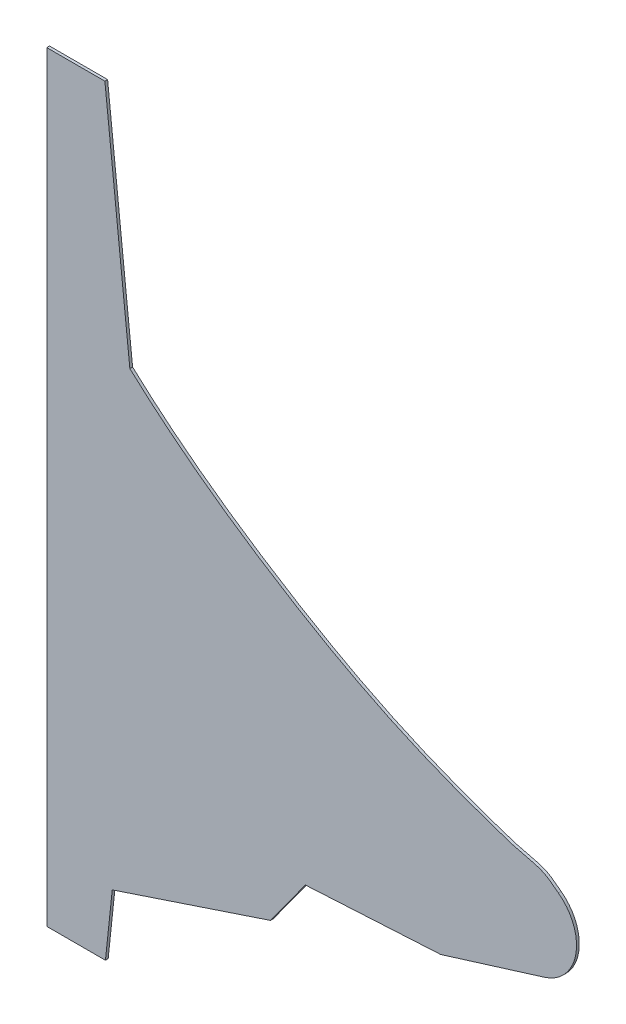
ISO-10303-21;
HEADER;
FILE_DESCRIPTION(('STEP AP214'),'2;1');
FILE_NAME('part.step','',(''),(''),'','','');
FILE_SCHEMA(('AUTOMOTIVE_DESIGN { 1 0 10303 214 1 1 1 1 }'));
ENDSEC;
DATA;
#1=APPLICATION_CONTEXT('core data for automotive mechanical design processes');
#2=APPLICATION_PROTOCOL_DEFINITION('international standard','automotive_design',2000,#1);
#3=PRODUCT_CONTEXT('',#1,'mechanical');
#4=PRODUCT('Part','Part','',(#3));
#5=PRODUCT_RELATED_PRODUCT_CATEGORY('part','',(#4));
#6=PRODUCT_DEFINITION_FORMATION('','',#4);
#7=PRODUCT_DEFINITION_CONTEXT('part definition',#1,'design');
#8=PRODUCT_DEFINITION('design','',#6,#7);
#9=PRODUCT_DEFINITION_SHAPE('','',#8);
#10=(LENGTH_UNIT() NAMED_UNIT(*) SI_UNIT(.MILLI.,.METRE.));
#11=(NAMED_UNIT(*) PLANE_ANGLE_UNIT() SI_UNIT($,.RADIAN.));
#12=(NAMED_UNIT(*) SI_UNIT($,.STERADIAN.) SOLID_ANGLE_UNIT());
#13=UNCERTAINTY_MEASURE_WITH_UNIT(LENGTH_MEASURE(1.E-05),#10,'distance_accuracy_value','');
#14=(GEOMETRIC_REPRESENTATION_CONTEXT(3) GLOBAL_UNCERTAINTY_ASSIGNED_CONTEXT((#13)) GLOBAL_UNIT_ASSIGNED_CONTEXT((#10,
#11,#12)) REPRESENTATION_CONTEXT('',''));
#15=CARTESIAN_POINT('',(0.,0.,0.));
#16=DIRECTION('',(0.,0.,1.));
#17=DIRECTION('',(1.,0.,0.));
#18=AXIS2_PLACEMENT_3D('',#15,#16,#17);
#19=CARTESIAN_POINT('',(10.3654221407447,74.8313731891077,0.23));
#20=DIRECTION('',(0.,-1.,0.));
#21=DIRECTION('',(0.,0.,-1.));
#22=AXIS2_PLACEMENT_3D('',#19,#20,#21);
#23=PLANE('',#22);
#24=DIRECTION('',(-1.,0.,0.));
#25=VECTOR('',#24,1.);
#26=CARTESIAN_POINT('',(10.3654221407447,74.8313731891077,0.));
#27=LINE('',#26,#25);
#28=CARTESIAN_POINT('',(15.256321742071,74.8313731891077,0.));
#29=VERTEX_POINT('',#28);
#30=CARTESIAN_POINT('',(10.3654221407447,74.8313731891077,0.));
#31=VERTEX_POINT('',#30);
#32=EDGE_CURVE('E199',#29,#31,#27,.T.);
#33=ORIENTED_EDGE('',*,*,#32,.T.);
#34=DIRECTION('',(0.,0.,-1.));
#35=VECTOR('',#34,1.);
#36=CARTESIAN_POINT('',(10.3654221407447,74.8313731891077,0.23));
#37=LINE('',#36,#35);
#38=CARTESIAN_POINT('',(10.3654221407447,74.8313731891077,0.23));
#39=VERTEX_POINT('',#38);
#40=EDGE_CURVE('E11',#39,#31,#37,.T.);
#41=ORIENTED_EDGE('',*,*,#40,.F.);
#42=DIRECTION('',(-1.,0.,0.));
#43=VECTOR('',#42,1.);
#44=CARTESIAN_POINT('',(10.3654221407447,74.8313731891077,0.23));
#45=LINE('',#44,#43);
#46=CARTESIAN_POINT('',(15.256321742071,74.8313731891077,0.23));
#47=VERTEX_POINT('',#46);
#48=EDGE_CURVE('E228',#47,#39,#45,.T.);
#49=ORIENTED_EDGE('',*,*,#48,.F.);
#50=DIRECTION('',(0.,0.,-1.));
#51=VECTOR('',#50,1.);
#52=CARTESIAN_POINT('',(15.256321742071,74.8313731891077,0.23));
#53=LINE('',#52,#51);
#54=EDGE_CURVE('E143',#47,#29,#53,.T.);
#55=ORIENTED_EDGE('',*,*,#54,.T.);
#56=EDGE_LOOP('',(#33,#41,#49,#55));
#57=FACE_BOUND('',#56,.T.);
#58=ADVANCED_FACE('F33',(#57),#23,.F.);
#59=CARTESIAN_POINT('',(10.3654221407447,74.8313731891077,0.23));
#60=DIRECTION('',(1.,0.,0.));
#61=DIRECTION('',(0.,1.,0.));
#62=AXIS2_PLACEMENT_3D('',#59,#60,#61);
#63=PLANE('',#62);
#64=DIRECTION('',(0.,-1.,0.));
#65=VECTOR('',#64,1.);
#66=CARTESIAN_POINT('',(10.3654221407447,74.8313731891077,0.));
#67=LINE('',#66,#65);
#68=CARTESIAN_POINT('',(10.3654221407447,10.7767070281172,0.));
#69=VERTEX_POINT('',#68);
#70=EDGE_CURVE('E190',#31,#69,#67,.T.);
#71=ORIENTED_EDGE('',*,*,#70,.T.);
#72=DIRECTION('',(0.,0.,-1.));
#73=VECTOR('',#72,1.);
#74=CARTESIAN_POINT('',(10.3654221407447,10.7767070281172,0.23));
#75=LINE('',#74,#73);
#76=CARTESIAN_POINT('',(10.3654221407447,10.7767070281172,0.23));
#77=VERTEX_POINT('',#76);
#78=EDGE_CURVE('E41',#77,#69,#75,.T.);
#79=ORIENTED_EDGE('',*,*,#78,.F.);
#80=DIRECTION('',(0.,-1.,0.));
#81=VECTOR('',#80,1.);
#82=CARTESIAN_POINT('',(10.3654221407447,74.8313731891077,0.23));
#83=LINE('',#82,#81);
#84=EDGE_CURVE('E101',#39,#77,#83,.T.);
#85=ORIENTED_EDGE('',*,*,#84,.F.);
#86=ORIENTED_EDGE('',*,*,#40,.T.);
#87=EDGE_LOOP('',(#71,#79,#85,#86));
#88=FACE_BOUND('',#87,.T.);
#89=ADVANCED_FACE('F183',(#88),#63,.F.);
#90=CARTESIAN_POINT('',(10.3654221407447,10.7767070281172,0.23));
#91=DIRECTION('',(0.,1.,0.));
#92=DIRECTION('',(0.,0.,1.));
#93=AXIS2_PLACEMENT_3D('',#90,#91,#92);
#94=PLANE('',#93);
#95=DIRECTION('',(1.,0.,0.));
#96=VECTOR('',#95,1.);
#97=CARTESIAN_POINT('',(10.3654221407447,10.7767070281172,0.));
#98=LINE('',#97,#96);
#99=CARTESIAN_POINT('',(15.3029753186407,10.7767070281172,0.));
#100=VERTEX_POINT('',#99);
#101=EDGE_CURVE('E198',#69,#100,#98,.T.);
#102=ORIENTED_EDGE('',*,*,#101,.T.);
#103=DIRECTION('',(0.,0.,-1.));
#104=VECTOR('',#103,1.);
#105=CARTESIAN_POINT('',(15.3029753186407,10.7767070281172,0.23));
#106=LINE('',#105,#104);
#107=CARTESIAN_POINT('',(15.3029753186407,10.7767070281172,0.23));
#108=VERTEX_POINT('',#107);
#109=EDGE_CURVE('E204',#108,#100,#106,.T.);
#110=ORIENTED_EDGE('',*,*,#109,.F.);
#111=DIRECTION('',(1.,0.,0.));
#112=VECTOR('',#111,1.);
#113=CARTESIAN_POINT('',(10.3654221407447,10.7767070281172,0.23));
#114=LINE('',#113,#112);
#115=EDGE_CURVE('E203',#77,#108,#114,.T.);
#116=ORIENTED_EDGE('',*,*,#115,.F.);
#117=ORIENTED_EDGE('',*,*,#78,.T.);
#118=EDGE_LOOP('',(#102,#110,#116,#117));
#119=FACE_BOUND('',#118,.T.);
#120=ADVANCED_FACE('F180',(#119),#94,.F.);
#121=CARTESIAN_POINT('',(15.3029753186407,10.7767070281172,0.23));
#122=DIRECTION('',(-0.994445105699646,0.105256504549693,0.));
#123=DIRECTION('',(-0.105256504549693,-0.994445105699646,0.));
#124=AXIS2_PLACEMENT_3D('',#121,#122,#123);
#125=PLANE('',#124);
#126=DIRECTION('',(0.105256504549693,0.994445105699646,0.));
#127=VECTOR('',#126,1.);
#128=CARTESIAN_POINT('',(15.3029753186407,10.7767070281172,0.));
#129=LINE('',#128,#127);
#130=CARTESIAN_POINT('',(15.8764924252464,16.1951966705297,0.));
#131=VERTEX_POINT('',#130);
#132=EDGE_CURVE('E208',#100,#131,#129,.T.);
#133=ORIENTED_EDGE('',*,*,#132,.T.);
#134=DIRECTION('',(0.,0.,-1.));
#135=VECTOR('',#134,1.);
#136=CARTESIAN_POINT('',(15.8764924252464,16.1951966705297,0.23));
#137=LINE('',#136,#135);
#138=CARTESIAN_POINT('',(15.8764924252464,16.1951966705297,0.23));
#139=VERTEX_POINT('',#138);
#140=EDGE_CURVE('E241',#139,#131,#137,.T.);
#141=ORIENTED_EDGE('',*,*,#140,.F.);
#142=DIRECTION('',(0.105256504549693,0.994445105699646,0.));
#143=VECTOR('',#142,1.);
#144=CARTESIAN_POINT('',(15.3029753186407,10.7767070281172,0.23));
#145=LINE('',#144,#143);
#146=EDGE_CURVE('E246',#108,#139,#145,.T.);
#147=ORIENTED_EDGE('',*,*,#146,.F.);
#148=ORIENTED_EDGE('',*,*,#109,.T.);
#149=EDGE_LOOP('',(#133,#141,#147,#148));
#150=FACE_BOUND('',#149,.T.);
#151=ADVANCED_FACE('F176',(#150),#125,.F.);
#152=CARTESIAN_POINT('',(15.8764924252464,16.1951966705297,0.23));
#153=DIRECTION('',(-0.315711066166802,0.948855375017616,0.));
#154=DIRECTION('',(-0.948855375017616,-0.315711066166802,0.));
#155=AXIS2_PLACEMENT_3D('',#152,#153,#154);
#156=PLANE('',#155);
#157=DIRECTION('',(0.948855375017616,0.315711066166802,0.));
#158=VECTOR('',#157,1.);
#159=CARTESIAN_POINT('',(15.8764924252464,16.1951966705297,0.));
#160=LINE('',#159,#158);
#161=CARTESIAN_POINT('',(29.1952251447183,20.6267163916221,0.));
#162=VERTEX_POINT('',#161);
#163=EDGE_CURVE('E210',#131,#162,#160,.T.);
#164=ORIENTED_EDGE('',*,*,#163,.T.);
#165=DIRECTION('',(0.,0.,-1.));
#166=VECTOR('',#165,1.);
#167=CARTESIAN_POINT('',(29.1952251447183,20.6267163916221,0.23));
#168=LINE('',#167,#166);
#169=CARTESIAN_POINT('',(29.1952251447183,20.6267163916221,0.23));
#170=VERTEX_POINT('',#169);
#171=EDGE_CURVE('E238',#170,#162,#168,.T.);
#172=ORIENTED_EDGE('',*,*,#171,.F.);
#173=DIRECTION('',(0.948855375017616,0.315711066166802,0.));
#174=VECTOR('',#173,1.);
#175=CARTESIAN_POINT('',(15.8764924252464,16.1951966705297,0.23));
#176=LINE('',#175,#174);
#177=EDGE_CURVE('E248',#139,#170,#176,.T.);
#178=ORIENTED_EDGE('',*,*,#177,.F.);
#179=ORIENTED_EDGE('',*,*,#140,.T.);
#180=EDGE_LOOP('',(#164,#172,#178,#179));
#181=FACE_BOUND('',#180,.T.);
#182=ADVANCED_FACE('F172',(#181),#156,.F.);
#183=CARTESIAN_POINT('',(29.1952251447183,20.6267163916221,0.23));
#184=DIRECTION('',(-0.809610443394388,0.586967571460931,0.));
#185=DIRECTION('',(-0.586967571460931,-0.809610443394388,0.));
#186=AXIS2_PLACEMENT_3D('',#183,#184,#185);
#187=PLANE('',#186);
#188=DIRECTION('',(0.586967571460931,0.809610443394387,0.));
#189=VECTOR('',#188,1.);
#190=CARTESIAN_POINT('',(29.1952251447183,20.6267163916221,0.));
#191=LINE('',#190,#189);
#192=CARTESIAN_POINT('',(32.1311092142506,24.6762116599427,0.));
#193=VERTEX_POINT('',#192);
#194=EDGE_CURVE('E214',#162,#193,#191,.T.);
#195=ORIENTED_EDGE('',*,*,#194,.T.);
#196=DIRECTION('',(0.,0.,-1.));
#197=VECTOR('',#196,1.);
#198=CARTESIAN_POINT('',(32.1311092142506,24.6762116599427,0.23));
#199=LINE('',#198,#197);
#200=CARTESIAN_POINT('',(32.1311092142506,24.6762116599427,0.23));
#201=VERTEX_POINT('',#200);
#202=EDGE_CURVE('E235',#201,#193,#199,.T.);
#203=ORIENTED_EDGE('',*,*,#202,.F.);
#204=DIRECTION('',(0.586967571460931,0.809610443394387,0.));
#205=VECTOR('',#204,1.);
#206=CARTESIAN_POINT('',(29.1952251447183,20.6267163916221,0.23));
#207=LINE('',#206,#205);
#208=EDGE_CURVE('E250',#170,#201,#207,.T.);
#209=ORIENTED_EDGE('',*,*,#208,.F.);
#210=ORIENTED_EDGE('',*,*,#171,.T.);
#211=EDGE_LOOP('',(#195,#203,#209,#210));
#212=FACE_BOUND('',#211,.T.);
#213=ADVANCED_FACE('F168',(#212),#187,.F.);
#214=CARTESIAN_POINT('',(32.1311092142506,24.6762116599427,0.23));
#215=DIRECTION('',(-0.055258438295618,0.998472085236803,0.));
#216=DIRECTION('',(-0.998472085236803,-0.055258438295618,0.));
#217=AXIS2_PLACEMENT_3D('',#214,#215,#216);
#218=PLANE('',#217);
#219=DIRECTION('',(0.998472085236803,0.055258438295618,0.));
#220=VECTOR('',#219,1.);
#221=CARTESIAN_POINT('',(32.1311092142506,24.6762116599427,0.));
#222=LINE('',#221,#220);
#223=CARTESIAN_POINT('',(43.5206626622156,25.3065436899761,0.));
#224=VERTEX_POINT('',#223);
#225=EDGE_CURVE('E216',#193,#224,#222,.T.);
#226=ORIENTED_EDGE('',*,*,#225,.T.);
#227=DIRECTION('',(0.,0.,-1.));
#228=VECTOR('',#227,1.);
#229=CARTESIAN_POINT('',(43.5206626622156,25.3065436899761,0.23));
#230=LINE('',#229,#228);
#231=CARTESIAN_POINT('',(43.5206626622156,25.3065436899761,0.23));
#232=VERTEX_POINT('',#231);
#233=EDGE_CURVE('E232',#232,#224,#230,.T.);
#234=ORIENTED_EDGE('',*,*,#233,.F.);
#235=DIRECTION('',(0.998472085236803,0.055258438295618,0.));
#236=VECTOR('',#235,1.);
#237=CARTESIAN_POINT('',(32.1311092142506,24.6762116599427,0.23));
#238=LINE('',#237,#236);
#239=EDGE_CURVE('E256',#201,#232,#238,.T.);
#240=ORIENTED_EDGE('',*,*,#239,.F.);
#241=ORIENTED_EDGE('',*,*,#202,.T.);
#242=EDGE_LOOP('',(#226,#234,#240,#241));
#243=FACE_BOUND('',#242,.T.);
#244=ADVANCED_FACE('F164',(#243),#218,.F.);
#245=CARTESIAN_POINT('',(43.5206626622156,25.3065436899761,0.23));
#246=DIRECTION('',(-0.296030130531952,0.955178602051593,0.));
#247=DIRECTION('',(-0.955178602051593,-0.296030130531952,0.));
#248=AXIS2_PLACEMENT_3D('',#245,#246,#247);
#249=PLANE('',#248);
#250=DIRECTION('',(0.955178602051593,0.296030130531952,0.));
#251=VECTOR('',#250,1.);
#252=CARTESIAN_POINT('',(43.5206626622156,25.3065436899761,0.));
#253=LINE('',#252,#251);
#254=CARTESIAN_POINT('',(52.2515158167673,28.0124204688799,0.));
#255=VERTEX_POINT('',#254);
#256=EDGE_CURVE('E218',#224,#255,#253,.T.);
#257=ORIENTED_EDGE('',*,*,#256,.T.);
#258=DIRECTION('',(0.,0.,-1.));
#259=VECTOR('',#258,1.);
#260=CARTESIAN_POINT('',(52.2515158167673,28.0124204688799,0.23));
#261=LINE('',#260,#259);
#262=CARTESIAN_POINT('',(52.2515158167673,28.0124204688799,0.23));
#263=VERTEX_POINT('',#262);
#264=EDGE_CURVE('E138',#263,#255,#261,.T.);
#265=ORIENTED_EDGE('',*,*,#264,.F.);
#266=DIRECTION('',(0.955178602051593,0.296030130531952,0.));
#267=VECTOR('',#266,1.);
#268=CARTESIAN_POINT('',(43.5206626622156,25.3065436899761,0.23));
#269=LINE('',#268,#267);
#270=EDGE_CURVE('E129',#232,#263,#269,.T.);
#271=ORIENTED_EDGE('',*,*,#270,.F.);
#272=ORIENTED_EDGE('',*,*,#233,.T.);
#273=EDGE_LOOP('',(#257,#265,#271,#272));
#274=FACE_BOUND('',#273,.T.);
#275=ADVANCED_FACE('F161',(#274),#249,.F.);
#276=CARTESIAN_POINT('',(51.1148251050605,31.6800966038128,0.23));
#277=DIRECTION('',(0.,0.,-1.));
#278=DIRECTION('',(-1.,0.,0.));
#279=AXIS2_PLACEMENT_3D('',#276,#277,#278);
#280=CYLINDRICAL_SURFACE('',#279,3.83978046310422);
#281=CARTESIAN_POINT('',(51.1148251050605,31.6800966038128,0.));
#282=DIRECTION('',(0.,0.,1.));
#283=DIRECTION('',(1.,0.,0.));
#284=AXIS2_PLACEMENT_3D('',#281,#282,#283);
#285=CIRCLE('',#284,3.83978046310422);
#286=CARTESIAN_POINT('',(53.429432122029,34.7438375135239,0.));
#287=VERTEX_POINT('',#286);
#288=EDGE_CURVE('E137',#255,#287,#285,.T.);
#289=ORIENTED_EDGE('',*,*,#288,.T.);
#290=DIRECTION('',(0.,0.,-1.));
#291=VECTOR('',#290,1.);
#292=CARTESIAN_POINT('',(53.429432122029,34.7438375135239,0.23));
#293=LINE('',#292,#291);
#294=CARTESIAN_POINT('',(53.429432122029,34.7438375135239,0.23));
#295=VERTEX_POINT('',#294);
#296=EDGE_CURVE('E134',#295,#287,#293,.T.);
#297=ORIENTED_EDGE('',*,*,#296,.F.);
#298=CARTESIAN_POINT('',(51.1148251050605,31.6800966038128,0.23));
#299=DIRECTION('',(0.,0.,1.));
#300=DIRECTION('',(1.,0.,0.));
#301=AXIS2_PLACEMENT_3D('',#298,#299,#300);
#302=CIRCLE('',#301,3.83978046310422);
#303=EDGE_CURVE('E123',#263,#295,#302,.T.);
#304=ORIENTED_EDGE('',*,*,#303,.F.);
#305=ORIENTED_EDGE('',*,*,#264,.T.);
#306=EDGE_LOOP('',(#289,#297,#304,#305));
#307=FACE_BOUND('',#306,.T.);
#308=ADVANCED_FACE('F135',(#307),#280,.T.);
#309=CARTESIAN_POINT('',(53.429432122029,34.7438375135239,0.23));
#310=CARTESIAN_POINT('',(52.7082932722181,35.3232728864593,0.23));
#311=CARTESIAN_POINT('',(52.2697031629987,35.6131144761852,0.23));
#312=CARTESIAN_POINT('',(51.2836956746977,35.9178693243215,0.23));
#313=CARTESIAN_POINT('',(49.9312372793995,36.2002867511667,0.23));
#314=CARTESIAN_POINT('',(47.4533510589778,37.0341270217347,0.23));
#315=CARTESIAN_POINT('',(42.4656358710808,38.8112528670234,0.23));
#316=CARTESIAN_POINT('',(36.5343821221219,41.5777759577479,0.23));
#317=CARTESIAN_POINT('',(27.618442158534,46.7462719271241,0.23));
#318=CARTESIAN_POINT('',(21.3758163508818,51.2209191889196,0.23));
#319=CARTESIAN_POINT('',(17.3592044013322,54.9271401147844,0.23));
#320=B_SPLINE_CURVE_WITH_KNOTS('',3,(#309,#310,#311,#312,#313,#314,#315,#316,#317,#318,#319),
.UNSPECIFIED.,.F.,.F.,(4,1,1,1,1,1,1,1,4),(0.,0.0484450739666011,0.0567962709901799,
0.083511970235788,0.134519875046334,0.263018925008965,0.449629807290894,0.608995438291088,1.),.UNSPECIFIED.);
#321=DIRECTION('',(0.,0.,-1.));
#322=VECTOR('',#321,1.);
#323=SURFACE_OF_LINEAR_EXTRUSION('',#320,#322);
#324=CARTESIAN_POINT('',(53.429432122029,34.7438375135239,0.));
#325=CARTESIAN_POINT('',(52.7082932722181,35.3232728864593,0.));
#326=CARTESIAN_POINT('',(52.2697031629987,35.6131144761852,0.));
#327=CARTESIAN_POINT('',(51.2836956746977,35.9178693243215,0.));
#328=CARTESIAN_POINT('',(49.9312372793995,36.2002867511667,0.));
#329=CARTESIAN_POINT('',(47.4533510589778,37.0341270217347,0.));
#330=CARTESIAN_POINT('',(42.4656358710808,38.8112528670234,0.));
#331=CARTESIAN_POINT('',(36.5343821221219,41.5777759577479,0.));
#332=CARTESIAN_POINT('',(27.618442158534,46.7462719271241,0.));
#333=CARTESIAN_POINT('',(21.3758163508818,51.2209191889196,0.));
#334=CARTESIAN_POINT('',(17.3592044013322,54.9271401147844,0.));
#335=B_SPLINE_CURVE_WITH_KNOTS('',3,(#324,#325,#326,#327,#328,#329,#330,#331,#332,#333,#334),
.UNSPECIFIED.,.F.,.F.,(4,1,1,1,1,1,1,1,4),(0.,0.0484450739666011,0.0567962709901799,
0.083511970235788,0.134519875046334,0.263018925008965,0.449629807290894,0.608995438291088,1.),.UNSPECIFIED.);
#336=CARTESIAN_POINT('',(17.3592044013322,54.9271401147844,0.));
#337=VERTEX_POINT('',#336);
#338=EDGE_CURVE('E87',#287,#337,#335,.T.);
#339=ORIENTED_EDGE('',*,*,#338,.T.);
#340=DIRECTION('',(0.,0.,-1.));
#341=VECTOR('',#340,1.);
#342=CARTESIAN_POINT('',(17.3592044013322,54.9271401147844,0.23));
#343=LINE('',#342,#341);
#344=CARTESIAN_POINT('',(17.3592044013322,54.9271401147844,0.23));
#345=VERTEX_POINT('',#344);
#346=EDGE_CURVE('E139',#345,#337,#343,.T.);
#347=ORIENTED_EDGE('',*,*,#346,.F.);
#348=EDGE_CURVE('E127',#295,#345,#320,.T.);
#349=ORIENTED_EDGE('',*,*,#348,.F.);
#350=ORIENTED_EDGE('',*,*,#296,.T.);
#351=EDGE_LOOP('',(#339,#347,#349,#350));
#352=FACE_BOUND('',#351,.T.);
#353=ADVANCED_FACE('F141',(#352),#323,.F.);
#354=CARTESIAN_POINT('',(15.256321742071,74.8313731891077,0.23));
#355=DIRECTION('',(-0.994465326796987,-0.105065283507742,0.));
#356=DIRECTION('',(0.105065283507742,-0.994465326796987,0.));
#357=AXIS2_PLACEMENT_3D('',#354,#355,#356);
#358=PLANE('',#357);
#359=DIRECTION('',(-0.105065283507742,0.994465326796987,0.));
#360=VECTOR('',#359,1.);
#361=CARTESIAN_POINT('',(15.256321742071,74.8313731891077,0.));
#362=LINE('',#361,#360);
#363=EDGE_CURVE('E93',#337,#29,#362,.T.);
#364=ORIENTED_EDGE('',*,*,#363,.T.);
#365=ORIENTED_EDGE('',*,*,#54,.F.);
#366=DIRECTION('',(-0.105065283507742,0.994465326796987,0.));
#367=VECTOR('',#366,1.);
#368=CARTESIAN_POINT('',(15.256321742071,74.8313731891077,0.23));
#369=LINE('',#368,#367);
#370=EDGE_CURVE('E49',#345,#47,#369,.T.);
#371=ORIENTED_EDGE('',*,*,#370,.F.);
#372=ORIENTED_EDGE('',*,*,#346,.T.);
#373=EDGE_LOOP('',(#364,#365,#371,#372));
#374=FACE_BOUND('',#373,.T.);
#375=ADVANCED_FACE('F157',(#374),#358,.F.);
#376=CARTESIAN_POINT('',(34.3872055990533,42.8579921869608,0.23));
#377=DIRECTION('',(0.,0.,-1.));
#378=DIRECTION('',(-1.,0.,0.));
#379=AXIS2_PLACEMENT_3D('',#376,#377,#378);
#380=PLANE('',#379);
#381=ORIENTED_EDGE('',*,*,#48,.T.);
#382=ORIENTED_EDGE('',*,*,#84,.T.);
#383=ORIENTED_EDGE('',*,*,#115,.T.);
#384=ORIENTED_EDGE('',*,*,#146,.T.);
#385=ORIENTED_EDGE('',*,*,#177,.T.);
#386=ORIENTED_EDGE('',*,*,#208,.T.);
#387=ORIENTED_EDGE('',*,*,#239,.T.);
#388=ORIENTED_EDGE('',*,*,#270,.T.);
#389=ORIENTED_EDGE('',*,*,#303,.T.);
#390=ORIENTED_EDGE('',*,*,#348,.T.);
#391=ORIENTED_EDGE('',*,*,#370,.T.);
#392=EDGE_LOOP('',(#381,#382,#383,#384,#385,#386,#387,#388,#389,#390,#391));
#393=FACE_BOUND('',#392,.T.);
#394=ADVANCED_FACE('F125',(#393),#380,.F.);
#395=CARTESIAN_POINT('',(34.3872055990533,42.8579921869608,0.));
#396=DIRECTION('',(0.,0.,-1.));
#397=DIRECTION('',(-1.,0.,0.));
#398=AXIS2_PLACEMENT_3D('',#395,#396,#397);
#399=PLANE('',#398);
#400=ORIENTED_EDGE('',*,*,#32,.F.);
#401=ORIENTED_EDGE('',*,*,#363,.F.);
#402=ORIENTED_EDGE('',*,*,#338,.F.);
#403=ORIENTED_EDGE('',*,*,#288,.F.);
#404=ORIENTED_EDGE('',*,*,#256,.F.);
#405=ORIENTED_EDGE('',*,*,#225,.F.);
#406=ORIENTED_EDGE('',*,*,#194,.F.);
#407=ORIENTED_EDGE('',*,*,#163,.F.);
#408=ORIENTED_EDGE('',*,*,#132,.F.);
#409=ORIENTED_EDGE('',*,*,#101,.F.);
#410=ORIENTED_EDGE('',*,*,#70,.F.);
#411=EDGE_LOOP('',(#400,#401,#402,#403,#404,#405,#406,#407,#408,#409,#410));
#412=FACE_BOUND('',#411,.T.);
#413=ADVANCED_FACE('F206',(#412),#399,.T.);
#414=CLOSED_SHELL('',(#58,#89,#120,#151,#182,#213,#244,#275,#308,#353,#375,#394,#413));
#415=MANIFOLD_SOLID_BREP('B2',#414);
#416=ADVANCED_BREP_SHAPE_REPRESENTATION('',(#18,#415),#14);
#417=SHAPE_DEFINITION_REPRESENTATION(#9,#416);
ENDSEC;
END-ISO-10303-21;
